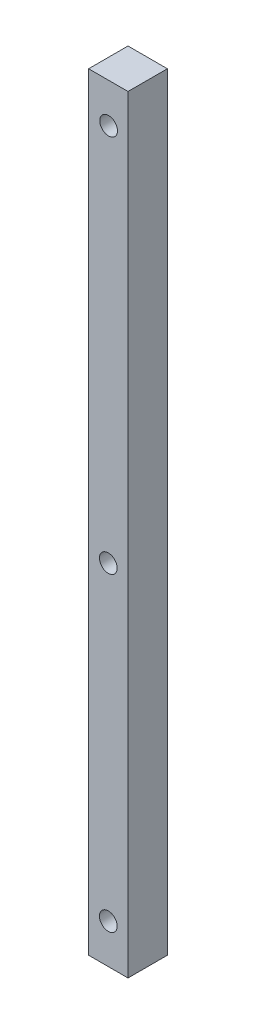
ISO-10303-21;
HEADER;
FILE_DESCRIPTION(('STEP AP214'),'2;1');
FILE_NAME('part.step','',(''),(''),'','','');
FILE_SCHEMA(('AUTOMOTIVE_DESIGN { 1 0 10303 214 1 1 1 1 }'));
ENDSEC;
DATA;
#1=APPLICATION_CONTEXT('core data for automotive mechanical design processes');
#2=APPLICATION_PROTOCOL_DEFINITION('international standard','automotive_design',2000,#1);
#3=PRODUCT_CONTEXT('',#1,'mechanical');
#4=PRODUCT('Part','Part','',(#3));
#5=PRODUCT_RELATED_PRODUCT_CATEGORY('part','',(#4));
#6=PRODUCT_DEFINITION_FORMATION('','',#4);
#7=PRODUCT_DEFINITION_CONTEXT('part definition',#1,'design');
#8=PRODUCT_DEFINITION('design','',#6,#7);
#9=PRODUCT_DEFINITION_SHAPE('','',#8);
#10=(LENGTH_UNIT() NAMED_UNIT(*) SI_UNIT(.MILLI.,.METRE.));
#11=(NAMED_UNIT(*) PLANE_ANGLE_UNIT() SI_UNIT($,.RADIAN.));
#12=(NAMED_UNIT(*) SI_UNIT($,.STERADIAN.) SOLID_ANGLE_UNIT());
#13=UNCERTAINTY_MEASURE_WITH_UNIT(LENGTH_MEASURE(1.E-05),#10,'distance_accuracy_value','');
#14=(GEOMETRIC_REPRESENTATION_CONTEXT(3) GLOBAL_UNCERTAINTY_ASSIGNED_CONTEXT((#13)) GLOBAL_UNIT_ASSIGNED_CONTEXT((#10,
#11,#12)) REPRESENTATION_CONTEXT('',''));
#15=CARTESIAN_POINT('',(0.,0.,0.));
#16=DIRECTION('',(0.,0.,1.));
#17=DIRECTION('',(1.,0.,0.));
#18=AXIS2_PLACEMENT_3D('',#15,#16,#17);
#19=CARTESIAN_POINT('',(0.,0.,5.08));
#20=DIRECTION('',(0.,0.,1.));
#21=DIRECTION('',(1.,0.,0.));
#22=AXIS2_PLACEMENT_3D('',#19,#20,#21);
#23=PLANE('',#22);
#24=CARTESIAN_POINT('',(-0.03937984496119,-134.018788317329,5.08));
#25=DIRECTION('',(0.,0.,1.));
#26=DIRECTION('',(1.,0.,0.));
#27=AXIS2_PLACEMENT_3D('',#24,#25,#26);
#28=CIRCLE('',#27,1.14300000000001);
#29=CARTESIAN_POINT('',(1.10362015503882,-134.018788317329,5.08));
#30=VERTEX_POINT('',#29);
#31=EDGE_CURVE('E117',#30,#30,#28,.T.);
#32=ORIENTED_EDGE('',*,*,#31,.F.);
#33=EDGE_LOOP('',(#32));
#34=FACE_BOUND('',#33,.T.);
#35=DIRECTION('',(0.,-1.,0.));
#36=VECTOR('',#35,1.);
#37=CARTESIAN_POINT('',(-2.57937984496126,-80.0559239293285,5.08));
#38=LINE('',#37,#36);
#39=CARTESIAN_POINT('',(-2.57937984496126,-80.0559239293285,5.08));
#40=VERTEX_POINT('',#39);
#41=CARTESIAN_POINT('',(-2.57937984496125,-179.098788317329,5.08));
#42=VERTEX_POINT('',#41);
#43=EDGE_CURVE('E87',#40,#42,#38,.T.);
#44=ORIENTED_EDGE('',*,*,#43,.T.);
#45=DIRECTION('',(1.,0.,0.));
#46=VECTOR('',#45,1.);
#47=CARTESIAN_POINT('',(-2.57937984496125,-179.098788317329,5.08));
#48=LINE('',#47,#46);
#49=CARTESIAN_POINT('',(2.50062015503875,-179.098788317329,5.08));
#50=VERTEX_POINT('',#49);
#51=EDGE_CURVE('E82',#42,#50,#48,.T.);
#52=ORIENTED_EDGE('',*,*,#51,.T.);
#53=DIRECTION('',(0.,1.,0.));
#54=VECTOR('',#53,1.);
#55=CARTESIAN_POINT('',(2.50062015503874,-80.0559239293285,5.08));
#56=LINE('',#55,#54);
#57=CARTESIAN_POINT('',(2.50062015503874,-80.0559239293285,5.08));
#58=VERTEX_POINT('',#57);
#59=EDGE_CURVE('E85',#50,#58,#56,.T.);
#60=ORIENTED_EDGE('',*,*,#59,.T.);
#61=DIRECTION('',(-1.,0.,0.));
#62=VECTOR('',#61,1.);
#63=CARTESIAN_POINT('',(-2.57937984496126,-80.0559239293285,5.08));
#64=LINE('',#63,#62);
#65=EDGE_CURVE('E52',#58,#40,#64,.T.);
#66=ORIENTED_EDGE('',*,*,#65,.T.);
#67=EDGE_LOOP('',(#44,#52,#60,#66));
#68=FACE_BOUND('',#67,.T.);
#69=CARTESIAN_POINT('',(0.,-85.1359239293285,5.08));
#70=DIRECTION('',(0.,0.,1.));
#71=DIRECTION('',(1.,0.,0.));
#72=AXIS2_PLACEMENT_3D('',#69,#70,#71);
#73=CIRCLE('',#72,1.14300000000001);
#74=CARTESIAN_POINT('',(1.14300000000001,-85.1359239293285,5.08));
#75=VERTEX_POINT('',#74);
#76=EDGE_CURVE('E102',#75,#75,#73,.T.);
#77=ORIENTED_EDGE('',*,*,#76,.F.);
#78=EDGE_LOOP('',(#77));
#79=FACE_BOUND('',#78,.T.);
#80=CARTESIAN_POINT('',(-0.03937984496119,-174.018788317329,5.08));
#81=DIRECTION('',(0.,0.,1.));
#82=DIRECTION('',(1.,0.,0.));
#83=AXIS2_PLACEMENT_3D('',#80,#81,#82);
#84=CIRCLE('',#83,1.14300000000001);
#85=CARTESIAN_POINT('',(1.10362015503882,-174.018788317329,5.08));
#86=VERTEX_POINT('',#85);
#87=EDGE_CURVE('E123',#86,#86,#84,.T.);
#88=ORIENTED_EDGE('',*,*,#87,.F.);
#89=EDGE_LOOP('',(#88));
#90=FACE_BOUND('',#89,.T.);
#91=ADVANCED_FACE('F35',(#34,#68,#79,#90),#23,.T.);
#92=CARTESIAN_POINT('',(0.,0.,0.));
#93=DIRECTION('',(0.,0.,1.));
#94=DIRECTION('',(1.,0.,0.));
#95=AXIS2_PLACEMENT_3D('',#92,#93,#94);
#96=PLANE('',#95);
#97=DIRECTION('',(0.,-1.,0.));
#98=VECTOR('',#97,1.);
#99=CARTESIAN_POINT('',(-2.57937984496126,-80.0559239293285,0.));
#100=LINE('',#99,#98);
#101=CARTESIAN_POINT('',(-2.57937984496126,-80.0559239293285,0.));
#102=VERTEX_POINT('',#101);
#103=CARTESIAN_POINT('',(-2.57937984496125,-179.098788317329,0.));
#104=VERTEX_POINT('',#103);
#105=EDGE_CURVE('E99',#102,#104,#100,.T.);
#106=ORIENTED_EDGE('',*,*,#105,.F.);
#107=DIRECTION('',(-1.,0.,0.));
#108=VECTOR('',#107,1.);
#109=CARTESIAN_POINT('',(-2.57937984496126,-80.0559239293285,0.));
#110=LINE('',#109,#108);
#111=CARTESIAN_POINT('',(2.50062015503874,-80.0559239293285,0.));
#112=VERTEX_POINT('',#111);
#113=EDGE_CURVE('E75',#112,#102,#110,.T.);
#114=ORIENTED_EDGE('',*,*,#113,.F.);
#115=DIRECTION('',(0.,1.,0.));
#116=VECTOR('',#115,1.);
#117=CARTESIAN_POINT('',(2.50062015503874,-80.0559239293285,0.));
#118=LINE('',#117,#116);
#119=CARTESIAN_POINT('',(2.50062015503875,-179.098788317329,0.));
#120=VERTEX_POINT('',#119);
#121=EDGE_CURVE('E69',#120,#112,#118,.T.);
#122=ORIENTED_EDGE('',*,*,#121,.F.);
#123=DIRECTION('',(1.,0.,0.));
#124=VECTOR('',#123,1.);
#125=CARTESIAN_POINT('',(-2.57937984496125,-179.098788317329,0.));
#126=LINE('',#125,#124);
#127=EDGE_CURVE('E91',#104,#120,#126,.T.);
#128=ORIENTED_EDGE('',*,*,#127,.F.);
#129=EDGE_LOOP('',(#106,#114,#122,#128));
#130=FACE_BOUND('',#129,.T.);
#131=CARTESIAN_POINT('',(0.,-85.1359239293285,0.));
#132=DIRECTION('',(0.,0.,1.));
#133=DIRECTION('',(1.,0.,0.));
#134=AXIS2_PLACEMENT_3D('',#131,#132,#133);
#135=CIRCLE('',#134,1.14300000000001);
#136=CARTESIAN_POINT('',(1.14300000000001,-85.1359239293285,0.));
#137=VERTEX_POINT('',#136);
#138=EDGE_CURVE('E114',#137,#137,#135,.T.);
#139=ORIENTED_EDGE('',*,*,#138,.T.);
#140=EDGE_LOOP('',(#139));
#141=FACE_BOUND('',#140,.T.);
#142=CARTESIAN_POINT('',(-0.03937984496119,-134.018788317329,0.));
#143=DIRECTION('',(0.,0.,1.));
#144=DIRECTION('',(1.,0.,0.));
#145=AXIS2_PLACEMENT_3D('',#142,#143,#144);
#146=CIRCLE('',#145,1.14300000000001);
#147=CARTESIAN_POINT('',(1.10362015503882,-134.018788317329,0.));
#148=VERTEX_POINT('',#147);
#149=EDGE_CURVE('E120',#148,#148,#146,.T.);
#150=ORIENTED_EDGE('',*,*,#149,.T.);
#151=EDGE_LOOP('',(#150));
#152=FACE_BOUND('',#151,.T.);
#153=CARTESIAN_POINT('',(-0.03937984496119,-174.018788317329,0.));
#154=DIRECTION('',(0.,0.,1.));
#155=DIRECTION('',(1.,0.,0.));
#156=AXIS2_PLACEMENT_3D('',#153,#154,#155);
#157=CIRCLE('',#156,1.14300000000001);
#158=CARTESIAN_POINT('',(1.10362015503882,-174.018788317329,0.));
#159=VERTEX_POINT('',#158);
#160=EDGE_CURVE('E126',#159,#159,#157,.T.);
#161=ORIENTED_EDGE('',*,*,#160,.T.);
#162=EDGE_LOOP('',(#161));
#163=FACE_BOUND('',#162,.T.);
#164=ADVANCED_FACE('F110',(#130,#141,#152,#163),#96,.F.);
#165=CARTESIAN_POINT('',(-2.57937984496126,-80.0559239293285,5.08));
#166=DIRECTION('',(1.,0.,0.));
#167=DIRECTION('',(0.,1.,0.));
#168=AXIS2_PLACEMENT_3D('',#165,#166,#167);
#169=PLANE('',#168);
#170=ORIENTED_EDGE('',*,*,#105,.T.);
#171=DIRECTION('',(0.,0.,-1.));
#172=VECTOR('',#171,1.);
#173=CARTESIAN_POINT('',(-2.57937984496125,-179.098788317329,5.08));
#174=LINE('',#173,#172);
#175=EDGE_CURVE('E11',#42,#104,#174,.T.);
#176=ORIENTED_EDGE('',*,*,#175,.F.);
#177=ORIENTED_EDGE('',*,*,#43,.F.);
#178=DIRECTION('',(0.,0.,-1.));
#179=VECTOR('',#178,1.);
#180=CARTESIAN_POINT('',(-2.57937984496126,-80.0559239293285,5.08));
#181=LINE('',#180,#179);
#182=EDGE_CURVE('E95',#40,#102,#181,.T.);
#183=ORIENTED_EDGE('',*,*,#182,.T.);
#184=EDGE_LOOP('',(#170,#176,#177,#183));
#185=FACE_BOUND('',#184,.T.);
#186=ADVANCED_FACE('F37',(#185),#169,.F.);
#187=CARTESIAN_POINT('',(-2.57937984496125,-179.098788317329,5.08));
#188=DIRECTION('',(0.,1.,0.));
#189=DIRECTION('',(0.,0.,1.));
#190=AXIS2_PLACEMENT_3D('',#187,#188,#189);
#191=PLANE('',#190);
#192=ORIENTED_EDGE('',*,*,#127,.T.);
#193=DIRECTION('',(0.,0.,-1.));
#194=VECTOR('',#193,1.);
#195=CARTESIAN_POINT('',(2.50062015503875,-179.098788317329,5.08));
#196=LINE('',#195,#194);
#197=EDGE_CURVE('E44',#50,#120,#196,.T.);
#198=ORIENTED_EDGE('',*,*,#197,.F.);
#199=ORIENTED_EDGE('',*,*,#51,.F.);
#200=ORIENTED_EDGE('',*,*,#175,.T.);
#201=EDGE_LOOP('',(#192,#198,#199,#200));
#202=FACE_BOUND('',#201,.T.);
#203=ADVANCED_FACE('F90',(#202),#191,.F.);
#204=CARTESIAN_POINT('',(2.50062015503874,-80.0559239293285,5.08));
#205=DIRECTION('',(-1.,0.,0.));
#206=DIRECTION('',(0.,-1.,0.));
#207=AXIS2_PLACEMENT_3D('',#204,#205,#206);
#208=PLANE('',#207);
#209=ORIENTED_EDGE('',*,*,#121,.T.);
#210=DIRECTION('',(0.,0.,-1.));
#211=VECTOR('',#210,1.);
#212=CARTESIAN_POINT('',(2.50062015503874,-80.0559239293285,5.08));
#213=LINE('',#212,#211);
#214=EDGE_CURVE('E92',#58,#112,#213,.T.);
#215=ORIENTED_EDGE('',*,*,#214,.F.);
#216=ORIENTED_EDGE('',*,*,#59,.F.);
#217=ORIENTED_EDGE('',*,*,#197,.T.);
#218=EDGE_LOOP('',(#209,#215,#216,#217));
#219=FACE_BOUND('',#218,.T.);
#220=ADVANCED_FACE('F93',(#219),#208,.F.);
#221=CARTESIAN_POINT('',(-2.57937984496126,-80.0559239293285,5.08));
#222=DIRECTION('',(0.,-1.,0.));
#223=DIRECTION('',(0.,0.,-1.));
#224=AXIS2_PLACEMENT_3D('',#221,#222,#223);
#225=PLANE('',#224);
#226=ORIENTED_EDGE('',*,*,#113,.T.);
#227=ORIENTED_EDGE('',*,*,#182,.F.);
#228=ORIENTED_EDGE('',*,*,#65,.F.);
#229=ORIENTED_EDGE('',*,*,#214,.T.);
#230=EDGE_LOOP('',(#226,#227,#228,#229));
#231=FACE_BOUND('',#230,.T.);
#232=ADVANCED_FACE('F107',(#231),#225,.F.);
#233=CARTESIAN_POINT('',(0.,-85.1359239293285,5.08));
#234=DIRECTION('',(0.,0.,-1.));
#235=DIRECTION('',(-1.,0.,0.));
#236=AXIS2_PLACEMENT_3D('',#233,#234,#235);
#237=CYLINDRICAL_SURFACE('',#236,1.14300000000001);
#238=ORIENTED_EDGE('',*,*,#76,.T.);
#239=EDGE_LOOP('',(#238));
#240=FACE_BOUND('',#239,.T.);
#241=ORIENTED_EDGE('',*,*,#138,.F.);
#242=EDGE_LOOP('',(#241));
#243=FACE_BOUND('',#242,.T.);
#244=ADVANCED_FACE('F144',(#240,#243),#237,.F.);
#245=CARTESIAN_POINT('',(-0.03937984496119,-134.018788317329,5.08));
#246=DIRECTION('',(0.,0.,-1.));
#247=DIRECTION('',(-1.,0.,0.));
#248=AXIS2_PLACEMENT_3D('',#245,#246,#247);
#249=CYLINDRICAL_SURFACE('',#248,1.14300000000001);
#250=ORIENTED_EDGE('',*,*,#31,.T.);
#251=EDGE_LOOP('',(#250));
#252=FACE_BOUND('',#251,.T.);
#253=ORIENTED_EDGE('',*,*,#149,.F.);
#254=EDGE_LOOP('',(#253));
#255=FACE_BOUND('',#254,.T.);
#256=ADVANCED_FACE('F190',(#252,#255),#249,.F.);
#257=CARTESIAN_POINT('',(-0.03937984496119,-174.018788317329,5.08));
#258=DIRECTION('',(0.,0.,-1.));
#259=DIRECTION('',(-1.,0.,0.));
#260=AXIS2_PLACEMENT_3D('',#257,#258,#259);
#261=CYLINDRICAL_SURFACE('',#260,1.14300000000001);
#262=ORIENTED_EDGE('',*,*,#87,.T.);
#263=EDGE_LOOP('',(#262));
#264=FACE_BOUND('',#263,.T.);
#265=ORIENTED_EDGE('',*,*,#160,.F.);
#266=EDGE_LOOP('',(#265));
#267=FACE_BOUND('',#266,.T.);
#268=ADVANCED_FACE('F132',(#264,#267),#261,.F.);
#269=CLOSED_SHELL('',(#91,#164,#186,#203,#220,#232,#244,#256,#268));
#270=MANIFOLD_SOLID_BREP('B2',#269);
#271=ADVANCED_BREP_SHAPE_REPRESENTATION('',(#18,#270),#14);
#272=SHAPE_DEFINITION_REPRESENTATION(#9,#271);
ENDSEC;
END-ISO-10303-21;
